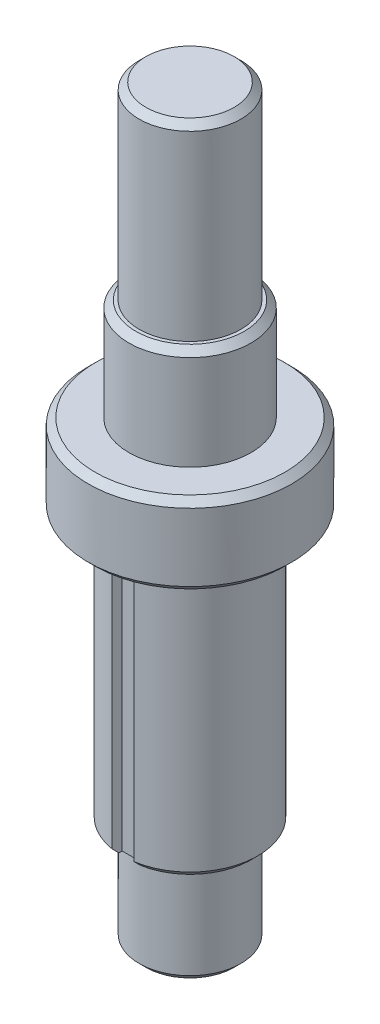
ISO-10303-21;
HEADER;
FILE_DESCRIPTION(('STEP AP214'),'2;1');
FILE_NAME('part.step','',(''),(''),'','','');
FILE_SCHEMA(('AUTOMOTIVE_DESIGN { 1 0 10303 214 1 1 1 1 }'));
ENDSEC;
DATA;
#1=APPLICATION_CONTEXT('core data for automotive mechanical design processes');
#2=APPLICATION_PROTOCOL_DEFINITION('international standard','automotive_design',2000,#1);
#3=PRODUCT_CONTEXT('',#1,'mechanical');
#4=PRODUCT('Part','Part','',(#3));
#5=PRODUCT_RELATED_PRODUCT_CATEGORY('part','',(#4));
#6=PRODUCT_DEFINITION_FORMATION('','',#4);
#7=PRODUCT_DEFINITION_CONTEXT('part definition',#1,'design');
#8=PRODUCT_DEFINITION('design','',#6,#7);
#9=PRODUCT_DEFINITION_SHAPE('','',#8);
#10=(LENGTH_UNIT() NAMED_UNIT(*) SI_UNIT(.MILLI.,.METRE.));
#11=(NAMED_UNIT(*) PLANE_ANGLE_UNIT() SI_UNIT($,.RADIAN.));
#12=(NAMED_UNIT(*) SI_UNIT($,.STERADIAN.) SOLID_ANGLE_UNIT());
#13=UNCERTAINTY_MEASURE_WITH_UNIT(LENGTH_MEASURE(1.E-05),#10,'distance_accuracy_value','');
#14=(GEOMETRIC_REPRESENTATION_CONTEXT(3) GLOBAL_UNCERTAINTY_ASSIGNED_CONTEXT((#13)) GLOBAL_UNIT_ASSIGNED_CONTEXT((#10,
#11,#12)) REPRESENTATION_CONTEXT('',''));
#15=CARTESIAN_POINT('',(0.,0.,0.));
#16=DIRECTION('',(0.,0.,1.));
#17=DIRECTION('',(1.,0.,0.));
#18=AXIS2_PLACEMENT_3D('',#15,#16,#17);
#19=CARTESIAN_POINT('',(0.,0.,0.));
#20=DIRECTION('',(0.,1.,0.));
#21=DIRECTION('',(-1.,0.,0.));
#22=AXIS2_PLACEMENT_3D('',#19,#20,#21);
#23=PLANE('',#22);
#24=CARTESIAN_POINT('',(0.,0.,0.));
#25=DIRECTION('',(0.,1.,0.));
#26=DIRECTION('',(-1.,0.,0.));
#27=AXIS2_PLACEMENT_3D('',#24,#25,#26);
#28=CIRCLE('',#27,6.50000000000002);
#29=CARTESIAN_POINT('',(-6.50000000000002,0.,0.));
#30=VERTEX_POINT('',#29);
#31=EDGE_CURVE('E211',#30,#30,#28,.F.);
#32=ORIENTED_EDGE('',*,*,#31,.T.);
#33=EDGE_LOOP('',(#32));
#34=FACE_BOUND('',#33,.T.);
#35=ADVANCED_FACE('F32',(#34),#23,.F.);
#36=CARTESIAN_POINT('',(0.,109.85,0.));
#37=DIRECTION('',(0.,1.,0.));
#38=DIRECTION('',(-1.,0.,0.));
#39=AXIS2_PLACEMENT_3D('',#36,#37,#38);
#40=CYLINDRICAL_SURFACE('',#39,7.5);
#41=CARTESIAN_POINT('',(0.,0.999999999999987,0.));
#42=DIRECTION('',(0.,1.,0.));
#43=DIRECTION('',(-1.,0.,0.));
#44=AXIS2_PLACEMENT_3D('',#41,#42,#43);
#45=CIRCLE('',#44,7.5);
#46=CARTESIAN_POINT('',(-7.5,0.999999999999987,0.));
#47=VERTEX_POINT('',#46);
#48=EDGE_CURVE('E208',#47,#47,#45,.T.);
#49=ORIENTED_EDGE('',*,*,#48,.T.);
#50=EDGE_LOOP('',(#49));
#51=FACE_BOUND('',#50,.T.);
#52=CARTESIAN_POINT('',(0.,15.,0.));
#53=DIRECTION('',(0.,1.,0.));
#54=DIRECTION('',(-1.,0.,0.));
#55=AXIS2_PLACEMENT_3D('',#52,#53,#54);
#56=CIRCLE('',#55,7.5);
#57=CARTESIAN_POINT('',(-7.5,15.,0.));
#58=VERTEX_POINT('',#57);
#59=EDGE_CURVE('E199',#58,#58,#56,.T.);
#60=ORIENTED_EDGE('',*,*,#59,.F.);
#61=EDGE_LOOP('',(#60));
#62=FACE_BOUND('',#61,.T.);
#63=ADVANCED_FACE('F283',(#51,#62),#40,.T.);
#64=CARTESIAN_POINT('',(7.5,15.,0.));
#65=DIRECTION('',(0.,1.,0.));
#66=DIRECTION('',(-1.,0.,0.));
#67=AXIS2_PLACEMENT_3D('',#64,#65,#66);
#68=PLANE('',#67);
#69=DIRECTION('',(0.,0.,-1.));
#70=VECTOR('',#69,1.);
#71=CARTESIAN_POINT('',(-1.625,15.,11.625));
#72=LINE('',#71,#70);
#73=CARTESIAN_POINT('',(-1.625,15.,8.85208308817759));
#74=VERTEX_POINT('',#73);
#75=CARTESIAN_POINT('',(-1.625,15.,8.375));
#76=VERTEX_POINT('',#75);
#77=EDGE_CURVE('E169',#74,#76,#72,.T.);
#78=ORIENTED_EDGE('',*,*,#77,.F.);
#79=CARTESIAN_POINT('',(0.,15.,0.));
#80=DIRECTION('',(0.,1.,0.));
#81=DIRECTION('',(-1.,0.,0.));
#82=AXIS2_PLACEMENT_3D('',#79,#80,#81);
#83=CIRCLE('',#82,8.99999999999998);
#84=CARTESIAN_POINT('',(1.625,15.,8.85208308817759));
#85=VERTEX_POINT('',#84);
#86=EDGE_CURVE('E61',#74,#85,#83,.F.);
#87=ORIENTED_EDGE('',*,*,#86,.T.);
#88=DIRECTION('',(0.,0.,1.));
#89=VECTOR('',#88,1.);
#90=CARTESIAN_POINT('',(1.625,15.,11.625));
#91=LINE('',#90,#89);
#92=CARTESIAN_POINT('',(1.625,15.,8.375));
#93=VERTEX_POINT('',#92);
#94=EDGE_CURVE('E164',#93,#85,#91,.T.);
#95=ORIENTED_EDGE('',*,*,#94,.F.);
#96=DIRECTION('',(1.,0.,0.));
#97=VECTOR('',#96,1.);
#98=CARTESIAN_POINT('',(-1.625,15.,8.375));
#99=LINE('',#98,#97);
#100=EDGE_CURVE('E165',#76,#93,#99,.T.);
#101=ORIENTED_EDGE('',*,*,#100,.F.);
#102=EDGE_LOOP('',(#78,#87,#95,#101));
#103=FACE_BOUND('',#102,.T.);
#104=ORIENTED_EDGE('',*,*,#59,.T.);
#105=EDGE_LOOP('',(#104));
#106=FACE_BOUND('',#105,.T.);
#107=ADVANCED_FACE('F279',(#103,#106),#68,.F.);
#108=CARTESIAN_POINT('',(0.,109.85,0.));
#109=DIRECTION('',(0.,1.,0.));
#110=DIRECTION('',(-1.,0.,0.));
#111=AXIS2_PLACEMENT_3D('',#108,#109,#110);
#112=CYLINDRICAL_SURFACE('',#111,10.);
#113=DIRECTION('',(0.,1.,0.));
#114=VECTOR('',#113,1.);
#115=CARTESIAN_POINT('',(1.625,109.85,9.86708543593294));
#116=LINE('',#115,#114);
#117=CARTESIAN_POINT('',(1.625,55.,9.86708543593294));
#118=VERTEX_POINT('',#117);
#119=CARTESIAN_POINT('',(1.625,16.,9.86708543593294));
#120=VERTEX_POINT('',#119);
#121=EDGE_CURVE('E175',#118,#120,#116,.F.);
#122=ORIENTED_EDGE('',*,*,#121,.T.);
#123=CARTESIAN_POINT('',(0.,16.,0.));
#124=DIRECTION('',(0.,1.,0.));
#125=DIRECTION('',(-1.,0.,0.));
#126=AXIS2_PLACEMENT_3D('',#123,#124,#125);
#127=CIRCLE('',#126,10.);
#128=CARTESIAN_POINT('',(-1.625,16.,9.86708543593294));
#129=VERTEX_POINT('',#128);
#130=EDGE_CURVE('E230',#120,#129,#127,.T.);
#131=ORIENTED_EDGE('',*,*,#130,.T.);
#132=DIRECTION('',(0.,1.,0.));
#133=VECTOR('',#132,1.);
#134=CARTESIAN_POINT('',(-1.625,109.85,9.86708543593294));
#135=LINE('',#134,#133);
#136=CARTESIAN_POINT('',(-1.625,55.,9.86708543593294));
#137=VERTEX_POINT('',#136);
#138=EDGE_CURVE('E187',#129,#137,#135,.T.);
#139=ORIENTED_EDGE('',*,*,#138,.T.);
#140=CARTESIAN_POINT('',(0.,55.,0.));
#141=DIRECTION('',(0.,1.,0.));
#142=DIRECTION('',(-1.,0.,0.));
#143=AXIS2_PLACEMENT_3D('',#140,#141,#142);
#144=CIRCLE('',#143,10.);
#145=EDGE_CURVE('E196',#118,#137,#144,.T.);
#146=ORIENTED_EDGE('',*,*,#145,.F.);
#147=EDGE_LOOP('',(#122,#131,#139,#146));
#148=FACE_BOUND('',#147,.T.);
#149=ADVANCED_FACE('F275',(#148),#112,.T.);
#150=CARTESIAN_POINT('',(10.,55.,0.));
#151=DIRECTION('',(0.,1.,0.));
#152=DIRECTION('',(-1.,0.,0.));
#153=AXIS2_PLACEMENT_3D('',#150,#151,#152);
#154=PLANE('',#153);
#155=CARTESIAN_POINT('',(0.,55.,0.));
#156=DIRECTION('',(0.,1.,0.));
#157=DIRECTION('',(-1.,0.,0.));
#158=AXIS2_PLACEMENT_3D('',#155,#156,#157);
#159=CIRCLE('',#158,14.);
#160=CARTESIAN_POINT('',(-14.,55.,0.));
#161=VERTEX_POINT('',#160);
#162=EDGE_CURVE('E223',#161,#161,#159,.F.);
#163=ORIENTED_EDGE('',*,*,#162,.T.);
#164=EDGE_LOOP('',(#163));
#165=FACE_BOUND('',#164,.T.);
#166=ORIENTED_EDGE('',*,*,#145,.T.);
#167=DIRECTION('',(0.,0.,-1.));
#168=VECTOR('',#167,1.);
#169=CARTESIAN_POINT('',(-1.625,55.,11.625));
#170=LINE('',#169,#168);
#171=CARTESIAN_POINT('',(-1.625,55.,8.375));
#172=VERTEX_POINT('',#171);
#173=EDGE_CURVE('E168',#137,#172,#170,.T.);
#174=ORIENTED_EDGE('',*,*,#173,.T.);
#175=DIRECTION('',(1.,0.,0.));
#176=VECTOR('',#175,1.);
#177=CARTESIAN_POINT('',(-1.625,55.,8.375));
#178=LINE('',#177,#176);
#179=CARTESIAN_POINT('',(1.625,55.,8.375));
#180=VERTEX_POINT('',#179);
#181=EDGE_CURVE('E177',#172,#180,#178,.T.);
#182=ORIENTED_EDGE('',*,*,#181,.T.);
#183=DIRECTION('',(0.,0.,1.));
#184=VECTOR('',#183,1.);
#185=CARTESIAN_POINT('',(1.625,55.,11.625));
#186=LINE('',#185,#184);
#187=EDGE_CURVE('E172',#180,#118,#186,.T.);
#188=ORIENTED_EDGE('',*,*,#187,.T.);
#189=EDGE_LOOP('',(#166,#174,#182,#188));
#190=FACE_BOUND('',#189,.T.);
#191=ADVANCED_FACE('F271',(#165,#190),#154,.F.);
#192=CARTESIAN_POINT('',(0.,109.85,0.));
#193=DIRECTION('',(0.,1.,0.));
#194=DIRECTION('',(-1.,0.,0.));
#195=AXIS2_PLACEMENT_3D('',#192,#193,#194);
#196=CYLINDRICAL_SURFACE('',#195,15.);
#197=CARTESIAN_POINT('',(0.,66.,0.));
#198=DIRECTION('',(0.,-1.,0.));
#199=DIRECTION('',(1.,0.,0.));
#200=AXIS2_PLACEMENT_3D('',#197,#198,#199);
#201=CIRCLE('',#200,15.);
#202=CARTESIAN_POINT('',(15.,66.,0.));
#203=VERTEX_POINT('',#202);
#204=EDGE_CURVE('E220',#203,#203,#201,.T.);
#205=ORIENTED_EDGE('',*,*,#204,.T.);
#206=EDGE_LOOP('',(#205));
#207=FACE_BOUND('',#206,.T.);
#208=CARTESIAN_POINT('',(0.,56.,0.));
#209=DIRECTION('',(0.,1.,0.));
#210=DIRECTION('',(-1.,0.,0.));
#211=AXIS2_PLACEMENT_3D('',#208,#209,#210);
#212=CIRCLE('',#211,15.);
#213=CARTESIAN_POINT('',(-15.,56.,0.));
#214=VERTEX_POINT('',#213);
#215=EDGE_CURVE('E217',#214,#214,#212,.T.);
#216=ORIENTED_EDGE('',*,*,#215,.T.);
#217=EDGE_LOOP('',(#216));
#218=FACE_BOUND('',#217,.T.);
#219=ADVANCED_FACE('F267',(#207,#218),#196,.T.);
#220=CARTESIAN_POINT('',(15.,67.,0.));
#221=DIRECTION('',(0.,-1.,0.));
#222=DIRECTION('',(1.,0.,0.));
#223=AXIS2_PLACEMENT_3D('',#220,#221,#222);
#224=PLANE('',#223);
#225=CARTESIAN_POINT('',(0.,67.,0.));
#226=DIRECTION('',(0.,-1.,0.));
#227=DIRECTION('',(1.,0.,0.));
#228=AXIS2_PLACEMENT_3D('',#225,#226,#227);
#229=CIRCLE('',#228,14.);
#230=CARTESIAN_POINT('',(14.,67.,0.));
#231=VERTEX_POINT('',#230);
#232=EDGE_CURVE('E214',#231,#231,#229,.F.);
#233=ORIENTED_EDGE('',*,*,#232,.T.);
#234=EDGE_LOOP('',(#233));
#235=FACE_BOUND('',#234,.T.);
#236=CARTESIAN_POINT('',(0.,67.,0.));
#237=DIRECTION('',(0.,1.,0.));
#238=DIRECTION('',(-1.,0.,0.));
#239=AXIS2_PLACEMENT_3D('',#236,#237,#238);
#240=CIRCLE('',#239,9.00000000000001);
#241=CARTESIAN_POINT('',(-1.625,67.,-8.85208308817761));
#242=VERTEX_POINT('',#241);
#243=CARTESIAN_POINT('',(1.625,67.,-8.85208308817761));
#244=VERTEX_POINT('',#243);
#245=EDGE_CURVE('E193',#242,#244,#240,.T.);
#246=ORIENTED_EDGE('',*,*,#245,.F.);
#247=DIRECTION('',(0.,0.,1.));
#248=VECTOR('',#247,1.);
#249=CARTESIAN_POINT('',(-1.625,67.,-10.625));
#250=LINE('',#249,#248);
#251=CARTESIAN_POINT('',(-1.625,67.,-7.375));
#252=VERTEX_POINT('',#251);
#253=EDGE_CURVE('E156',#242,#252,#250,.T.);
#254=ORIENTED_EDGE('',*,*,#253,.T.);
#255=DIRECTION('',(1.,0.,0.));
#256=VECTOR('',#255,1.);
#257=CARTESIAN_POINT('',(-1.625,67.,-7.375));
#258=LINE('',#257,#256);
#259=CARTESIAN_POINT('',(1.625,67.,-7.375));
#260=VERTEX_POINT('',#259);
#261=EDGE_CURVE('E141',#252,#260,#258,.T.);
#262=ORIENTED_EDGE('',*,*,#261,.T.);
#263=DIRECTION('',(0.,0.,-1.));
#264=VECTOR('',#263,1.);
#265=CARTESIAN_POINT('',(1.625,67.,-10.625));
#266=LINE('',#265,#264);
#267=EDGE_CURVE('E140',#260,#244,#266,.T.);
#268=ORIENTED_EDGE('',*,*,#267,.T.);
#269=EDGE_LOOP('',(#246,#254,#262,#268));
#270=FACE_BOUND('',#269,.T.);
#271=ADVANCED_FACE('F263',(#235,#270),#224,.F.);
#272=CARTESIAN_POINT('',(0.,109.85,0.));
#273=DIRECTION('',(0.,1.,0.));
#274=DIRECTION('',(-1.,0.,0.));
#275=AXIS2_PLACEMENT_3D('',#272,#273,#274);
#276=CYLINDRICAL_SURFACE('',#275,9.00000000000001);
#277=CARTESIAN_POINT('',(0.,81.,0.));
#278=DIRECTION('',(0.,-1.,0.));
#279=DIRECTION('',(1.,0.,0.));
#280=AXIS2_PLACEMENT_3D('',#277,#278,#279);
#281=CIRCLE('',#280,9.00000000000001);
#282=CARTESIAN_POINT('',(1.625,81.,-8.85208308817761));
#283=VERTEX_POINT('',#282);
#284=CARTESIAN_POINT('',(-1.625,81.,-8.85208308817761));
#285=VERTEX_POINT('',#284);
#286=EDGE_CURVE('E227',#283,#285,#281,.T.);
#287=ORIENTED_EDGE('',*,*,#286,.T.);
#288=DIRECTION('',(0.,1.,0.));
#289=VECTOR('',#288,1.);
#290=CARTESIAN_POINT('',(-1.625,109.85,-8.85208308817761));
#291=LINE('',#290,#289);
#292=EDGE_CURVE('E161',#285,#242,#291,.F.);
#293=ORIENTED_EDGE('',*,*,#292,.T.);
#294=ORIENTED_EDGE('',*,*,#245,.T.);
#295=DIRECTION('',(0.,1.,0.));
#296=VECTOR('',#295,1.);
#297=CARTESIAN_POINT('',(1.625,109.85,-8.85208308817761));
#298=LINE('',#297,#296);
#299=EDGE_CURVE('E153',#244,#283,#298,.T.);
#300=ORIENTED_EDGE('',*,*,#299,.T.);
#301=EDGE_LOOP('',(#287,#293,#294,#300));
#302=FACE_BOUND('',#301,.T.);
#303=ADVANCED_FACE('F260',(#302),#276,.T.);
#304=CARTESIAN_POINT('',(9.00000000000001,82.,0.));
#305=DIRECTION('',(0.,-1.,0.));
#306=DIRECTION('',(1.,0.,0.));
#307=AXIS2_PLACEMENT_3D('',#304,#305,#306);
#308=PLANE('',#307);
#309=DIRECTION('',(1.,0.,0.));
#310=VECTOR('',#309,1.);
#311=CARTESIAN_POINT('',(-1.625,82.,-7.375));
#312=LINE('',#311,#310);
#313=CARTESIAN_POINT('',(-1.625,82.,-7.375));
#314=VERTEX_POINT('',#313);
#315=CARTESIAN_POINT('',(-1.36358901432944,82.,-7.375));
#316=VERTEX_POINT('',#315);
#317=EDGE_CURVE('E137',#314,#316,#312,.T.);
#318=ORIENTED_EDGE('',*,*,#317,.F.);
#319=DIRECTION('',(0.,0.,1.));
#320=VECTOR('',#319,1.);
#321=CARTESIAN_POINT('',(-1.625,82.,-10.625));
#322=LINE('',#321,#320);
#323=CARTESIAN_POINT('',(-1.625,82.,-7.83322251694666));
#324=VERTEX_POINT('',#323);
#325=EDGE_CURVE('E135',#324,#314,#322,.T.);
#326=ORIENTED_EDGE('',*,*,#325,.F.);
#327=CARTESIAN_POINT('',(0.,82.,0.));
#328=DIRECTION('',(0.,-1.,0.));
#329=DIRECTION('',(1.,0.,0.));
#330=AXIS2_PLACEMENT_3D('',#327,#328,#329);
#331=CIRCLE('',#330,8.00000000000001);
#332=CARTESIAN_POINT('',(1.625,82.,-7.83322251694666));
#333=VERTEX_POINT('',#332);
#334=EDGE_CURVE('E148',#324,#333,#331,.F.);
#335=ORIENTED_EDGE('',*,*,#334,.T.);
#336=DIRECTION('',(0.,0.,-1.));
#337=VECTOR('',#336,1.);
#338=CARTESIAN_POINT('',(1.625,82.,-10.625));
#339=LINE('',#338,#337);
#340=CARTESIAN_POINT('',(1.625,82.,-7.375));
#341=VERTEX_POINT('',#340);
#342=EDGE_CURVE('E53',#341,#333,#339,.T.);
#343=ORIENTED_EDGE('',*,*,#342,.F.);
#344=CARTESIAN_POINT('',(1.36358901432944,82.,-7.375));
#345=VERTEX_POINT('',#344);
#346=EDGE_CURVE('E124',#345,#341,#312,.T.);
#347=ORIENTED_EDGE('',*,*,#346,.F.);
#348=CARTESIAN_POINT('',(0.,82.,0.));
#349=DIRECTION('',(0.,1.,0.));
#350=DIRECTION('',(-1.,0.,0.));
#351=AXIS2_PLACEMENT_3D('',#348,#349,#350);
#352=CIRCLE('',#351,7.5);
#353=EDGE_CURVE('E189',#316,#345,#352,.T.);
#354=ORIENTED_EDGE('',*,*,#353,.F.);
#355=EDGE_LOOP('',(#318,#326,#335,#343,#347,#354));
#356=FACE_BOUND('',#355,.T.);
#357=ADVANCED_FACE('F145',(#356),#308,.F.);
#358=CARTESIAN_POINT('',(0.,109.85,0.));
#359=DIRECTION('',(0.,1.,0.));
#360=DIRECTION('',(-1.,0.,0.));
#361=AXIS2_PLACEMENT_3D('',#358,#359,#360);
#362=CYLINDRICAL_SURFACE('',#361,7.5);
#363=CARTESIAN_POINT('',(0.,108.85,0.));
#364=DIRECTION('',(0.,-1.,0.));
#365=DIRECTION('',(1.,0.,0.));
#366=AXIS2_PLACEMENT_3D('',#363,#364,#365);
#367=CIRCLE('',#366,7.5);
#368=CARTESIAN_POINT('',(7.5,108.85,0.));
#369=VERTEX_POINT('',#368);
#370=EDGE_CURVE('E205',#369,#369,#367,.T.);
#371=ORIENTED_EDGE('',*,*,#370,.T.);
#372=EDGE_LOOP('',(#371));
#373=FACE_BOUND('',#372,.T.);
#374=EDGE_CURVE('E190',#345,#316,#352,.T.);
#375=ORIENTED_EDGE('',*,*,#374,.T.);
#376=ORIENTED_EDGE('',*,*,#353,.T.);
#377=EDGE_LOOP('',(#375,#376));
#378=FACE_BOUND('',#377,.T.);
#379=ADVANCED_FACE('F253',(#373,#378),#362,.T.);
#380=CARTESIAN_POINT('',(7.5,109.85,0.));
#381=DIRECTION('',(0.,-1.,0.));
#382=DIRECTION('',(1.,0.,0.));
#383=AXIS2_PLACEMENT_3D('',#380,#381,#382);
#384=PLANE('',#383);
#385=CARTESIAN_POINT('',(0.,109.85,0.));
#386=DIRECTION('',(0.,-1.,0.));
#387=DIRECTION('',(1.,0.,0.));
#388=AXIS2_PLACEMENT_3D('',#385,#386,#387);
#389=CIRCLE('',#388,6.49999999999999);
#390=CARTESIAN_POINT('',(6.49999999999999,109.85,0.));
#391=VERTEX_POINT('',#390);
#392=EDGE_CURVE('E202',#391,#391,#389,.F.);
#393=ORIENTED_EDGE('',*,*,#392,.T.);
#394=EDGE_LOOP('',(#393));
#395=FACE_BOUND('',#394,.T.);
#396=ADVANCED_FACE('F247',(#395),#384,.F.);
#397=CARTESIAN_POINT('',(-1.625,59.5961940777126,11.625));
#398=DIRECTION('',(-1.,0.,0.));
#399=DIRECTION('',(0.,0.,1.));
#400=AXIS2_PLACEMENT_3D('',#397,#398,#399);
#401=PLANE('',#400);
#402=ORIENTED_EDGE('',*,*,#138,.F.);
#403=CARTESIAN_POINT('',(-1.625,16.,9.86708543593294));
#404=CARTESIAN_POINT('',(-1.625,15.8331987737948,9.69805095141648));
#405=CARTESIAN_POINT('',(-1.625,15.6664648280521,9.52895018088338));
#406=CARTESIAN_POINT('',(-1.625,15.3331314947165,9.19061606496714));
#407=CARTESIAN_POINT('',(-1.625,15.1665321071259,9.02138271958178));
#408=CARTESIAN_POINT('',(-1.625,15.,8.85208308817759));
#409=B_SPLINE_CURVE_WITH_KNOTS('',3,(#403,#404,#405,#406,#407,#408),.UNSPECIFIED.,.F.,.F.,(4,2,
4),(0.,0.712430707732584,1.42486142732787),.UNSPECIFIED.);
#410=EDGE_CURVE('E233',#129,#74,#409,.T.);
#411=ORIENTED_EDGE('',*,*,#410,.T.);
#412=ORIENTED_EDGE('',*,*,#77,.T.);
#413=DIRECTION('',(0.,-1.,0.));
#414=VECTOR('',#413,1.);
#415=CARTESIAN_POINT('',(-1.625,59.5961940777126,8.375));
#416=LINE('',#415,#414);
#417=EDGE_CURVE('E180',#172,#76,#416,.T.);
#418=ORIENTED_EDGE('',*,*,#417,.F.);
#419=ORIENTED_EDGE('',*,*,#173,.F.);
#420=EDGE_LOOP('',(#402,#411,#412,#418,#419));
#421=FACE_BOUND('',#420,.T.);
#422=ADVANCED_FACE('F241',(#421),#401,.F.);
#423=CARTESIAN_POINT('',(1.625,59.5961940777126,11.625));
#424=DIRECTION('',(1.,0.,0.));
#425=DIRECTION('',(0.,0.,-1.));
#426=AXIS2_PLACEMENT_3D('',#423,#424,#425);
#427=PLANE('',#426);
#428=ORIENTED_EDGE('',*,*,#94,.T.);
#429=CARTESIAN_POINT('',(1.625,15.,8.85208308817759));
#430=CARTESIAN_POINT('',(1.625,15.1665321071259,9.02138271958178));
#431=CARTESIAN_POINT('',(1.625,15.3331314947165,9.19061606496714));
#432=CARTESIAN_POINT('',(1.625,15.6664648280521,9.52895018088339));
#433=CARTESIAN_POINT('',(1.625,15.8331987737948,9.69805095141648));
#434=CARTESIAN_POINT('',(1.625,16.,9.86708543593294));
#435=B_SPLINE_CURVE_WITH_KNOTS('',3,(#429,#430,#431,#432,#433,#434),.UNSPECIFIED.,.F.,.F.,(4,2,
4),(0.,0.712430719595283,1.42486142732787),.UNSPECIFIED.);
#436=EDGE_CURVE('E315',#85,#120,#435,.T.);
#437=ORIENTED_EDGE('',*,*,#436,.T.);
#438=ORIENTED_EDGE('',*,*,#121,.F.);
#439=ORIENTED_EDGE('',*,*,#187,.F.);
#440=DIRECTION('',(0.,-1.,0.));
#441=VECTOR('',#440,1.);
#442=CARTESIAN_POINT('',(1.625,59.5961940777126,8.375));
#443=LINE('',#442,#441);
#444=EDGE_CURVE('E176',#180,#93,#443,.T.);
#445=ORIENTED_EDGE('',*,*,#444,.T.);
#446=EDGE_LOOP('',(#428,#437,#438,#439,#445));
#447=FACE_BOUND('',#446,.T.);
#448=ADVANCED_FACE('F246',(#447),#427,.F.);
#449=CARTESIAN_POINT('',(-1.625,59.5961940777126,8.375));
#450=DIRECTION('',(0.,0.,-1.));
#451=DIRECTION('',(-1.,0.,0.));
#452=AXIS2_PLACEMENT_3D('',#449,#450,#451);
#453=PLANE('',#452);
#454=ORIENTED_EDGE('',*,*,#417,.T.);
#455=ORIENTED_EDGE('',*,*,#100,.T.);
#456=ORIENTED_EDGE('',*,*,#444,.F.);
#457=ORIENTED_EDGE('',*,*,#181,.F.);
#458=EDGE_LOOP('',(#454,#455,#456,#457));
#459=FACE_BOUND('',#458,.T.);
#460=ADVANCED_FACE('F249',(#459),#453,.F.);
#461=CARTESIAN_POINT('',(0.,109.85,0.));
#462=DIRECTION('',(0.,-1.,0.));
#463=DIRECTION('',(1.,0.,0.));
#464=AXIS2_PLACEMENT_3D('',#461,#462,#463);
#465=CONICAL_SURFACE('',#464,6.49999999999999,0.785398163397451);
#466=ORIENTED_EDGE('',*,*,#370,.F.);
#467=EDGE_LOOP('',(#466));
#468=FACE_BOUND('',#467,.T.);
#469=ORIENTED_EDGE('',*,*,#392,.F.);
#470=EDGE_LOOP('',(#469));
#471=FACE_BOUND('',#470,.T.);
#472=ADVANCED_FACE('F290',(#468,#471),#465,.T.);
#473=CARTESIAN_POINT('',(0.,0.999999999999987,0.));
#474=DIRECTION('',(0.,1.,0.));
#475=DIRECTION('',(-1.,0.,0.));
#476=AXIS2_PLACEMENT_3D('',#473,#474,#475);
#477=CONICAL_SURFACE('',#476,7.5,0.785398163397445);
#478=ORIENTED_EDGE('',*,*,#31,.F.);
#479=EDGE_LOOP('',(#478));
#480=FACE_BOUND('',#479,.T.);
#481=ORIENTED_EDGE('',*,*,#48,.F.);
#482=EDGE_LOOP('',(#481));
#483=FACE_BOUND('',#482,.T.);
#484=ADVANCED_FACE('F293',(#480,#483),#477,.T.);
#485=CARTESIAN_POINT('',(0.,67.,0.));
#486=DIRECTION('',(0.,-1.,0.));
#487=DIRECTION('',(1.,0.,0.));
#488=AXIS2_PLACEMENT_3D('',#485,#486,#487);
#489=CONICAL_SURFACE('',#488,14.,0.785398163397443);
#490=ORIENTED_EDGE('',*,*,#204,.F.);
#491=EDGE_LOOP('',(#490));
#492=FACE_BOUND('',#491,.T.);
#493=ORIENTED_EDGE('',*,*,#232,.F.);
#494=EDGE_LOOP('',(#493));
#495=FACE_BOUND('',#494,.T.);
#496=ADVANCED_FACE('F297',(#492,#495),#489,.T.);
#497=CARTESIAN_POINT('',(0.,56.,0.));
#498=DIRECTION('',(0.,1.,0.));
#499=DIRECTION('',(-1.,0.,0.));
#500=AXIS2_PLACEMENT_3D('',#497,#498,#499);
#501=CONICAL_SURFACE('',#500,15.,0.785398163397455);
#502=ORIENTED_EDGE('',*,*,#162,.F.);
#503=EDGE_LOOP('',(#502));
#504=FACE_BOUND('',#503,.T.);
#505=ORIENTED_EDGE('',*,*,#215,.F.);
#506=EDGE_LOOP('',(#505));
#507=FACE_BOUND('',#506,.T.);
#508=ADVANCED_FACE('F301',(#504,#507),#501,.T.);
#509=CARTESIAN_POINT('',(0.,82.,0.));
#510=DIRECTION('',(0.,-1.,0.));
#511=DIRECTION('',(1.,0.,0.));
#512=AXIS2_PLACEMENT_3D('',#509,#510,#511);
#513=CONICAL_SURFACE('',#512,8.00000000000001,0.785398163397447);
#514=CARTESIAN_POINT('',(-1.625,78.5367620013898,-11.3474755083578));
#515=CARTESIAN_POINT('',(-1.625,78.973028490968,-10.9067008366485));
#516=CARTESIAN_POINT('',(-1.625,79.4090909339114,-10.4657227931871));
#517=CARTESIAN_POINT('',(-1.625,80.2804530012764,-9.58302094821458));
#518=CARTESIAN_POINT('',(-1.625,80.7157526318521,-9.1412971527768));
#519=CARTESIAN_POINT('',(-1.625,81.3678708142734,-8.47789092046407));
#520=CARTESIAN_POINT('',(-1.625,81.5851057867356,-8.25661794657441));
#521=CARTESIAN_POINT('',(-1.625,82.0192161780506,-7.81371989164267));
#522=CARTESIAN_POINT('',(-1.625,82.2360915972019,-7.59209481089326));
#523=CARTESIAN_POINT('',(-1.625,82.6693870900651,-7.1483961463637));
#524=CARTESIAN_POINT('',(-1.625,82.885807160049,-6.92632255894065));
#525=CARTESIAN_POINT('',(-1.625,83.3180283034707,-6.48157272397844));
#526=CARTESIAN_POINT('',(-1.625,83.5338293751224,-6.25889647470398));
#527=CARTESIAN_POINT('',(-1.625,83.7492393846563,-6.0358415544423));
#528=B_SPLINE_CURVE_WITH_KNOTS('',3,(#514,#515,#516,#517,#518,#519,#520,#521,#522,#523,#524,
#525,#526,#527),.UNSPECIFIED.,.F.,.F.,(4,2,2,2,2,2,4),(0.,1.8605113973532,3.72100771495598,
4.65126264323239,5.58151679868638,6.51177854055999,7.44204296388435),.UNSPECIFIED.);
#529=EDGE_CURVE('E11',#285,#324,#528,.T.);
#530=ORIENTED_EDGE('',*,*,#529,.F.);
#531=ORIENTED_EDGE('',*,*,#286,.F.);
#532=CARTESIAN_POINT('',(1.625,83.7492393846563,-6.0358415544423));
#533=CARTESIAN_POINT('',(1.625,83.5338293751224,-6.25889647470398));
#534=CARTESIAN_POINT('',(1.625,83.3180283034707,-6.48157272397844));
#535=CARTESIAN_POINT('',(1.625,82.885807160049,-6.92632255894065));
#536=CARTESIAN_POINT('',(1.625,82.6693870900651,-7.1483961463637));
#537=CARTESIAN_POINT('',(1.625,82.2360915972019,-7.59209481089326));
#538=CARTESIAN_POINT('',(1.625,82.0192161780506,-7.81371989164266));
#539=CARTESIAN_POINT('',(1.625,81.5851057867356,-8.25661794657441));
#540=CARTESIAN_POINT('',(1.625,81.3678708142734,-8.47789092046407));
#541=CARTESIAN_POINT('',(1.625,80.7157526318521,-9.1412971527768));
#542=CARTESIAN_POINT('',(1.625,80.2804530012764,-9.58302094821459));
#543=CARTESIAN_POINT('',(1.625,79.4090909339114,-10.4657227931871));
#544=CARTESIAN_POINT('',(1.625,78.973028490968,-10.9067008366484));
#545=CARTESIAN_POINT('',(1.625,78.5367620013898,-11.3474755083578));
#546=B_SPLINE_CURVE_WITH_KNOTS('',3,(#532,#533,#534,#535,#536,#537,#538,#539,#540,#541,#542,
#543,#544,#545),.UNSPECIFIED.,.F.,.F.,(4,2,2,2,2,2,4),(0.,0.930264423324359,1.86052616519797,
2.79078032065196,3.72103524892837,5.58153156653115,7.44204296388435),.UNSPECIFIED.);
#547=EDGE_CURVE('E46',#333,#283,#546,.T.);
#548=ORIENTED_EDGE('',*,*,#547,.F.);
#549=ORIENTED_EDGE('',*,*,#334,.F.);
#550=EDGE_LOOP('',(#530,#531,#548,#549));
#551=FACE_BOUND('',#550,.T.);
#552=ADVANCED_FACE('F304',(#551),#513,.T.);
#553=CARTESIAN_POINT('',(0.,16.,0.));
#554=DIRECTION('',(0.,1.,0.));
#555=DIRECTION('',(-1.,0.,0.));
#556=AXIS2_PLACEMENT_3D('',#553,#554,#555);
#557=CONICAL_SURFACE('',#556,10.,0.78539816339745);
#558=ORIENTED_EDGE('',*,*,#436,.F.);
#559=ORIENTED_EDGE('',*,*,#86,.F.);
#560=ORIENTED_EDGE('',*,*,#410,.F.);
#561=ORIENTED_EDGE('',*,*,#130,.F.);
#562=EDGE_LOOP('',(#558,#559,#560,#561));
#563=FACE_BOUND('',#562,.T.);
#564=ADVANCED_FACE('F34',(#563),#557,.T.);
#565=CARTESIAN_POINT('',(0.,82.,0.));
#566=DIRECTION('',(0.,1.,0.));
#567=DIRECTION('',(0.,0.,1.));
#568=AXIS2_PLACEMENT_3D('',#565,#566,#567);
#569=PLANE('',#568);
#570=EDGE_CURVE('E131',#316,#345,#312,.T.);
#571=ORIENTED_EDGE('',*,*,#570,.F.);
#572=ORIENTED_EDGE('',*,*,#374,.F.);
#573=EDGE_LOOP('',(#571,#572));
#574=FACE_BOUND('',#573,.T.);
#575=ADVANCED_FACE('F325',(#574),#569,.F.);
#576=CARTESIAN_POINT('',(-1.625,62.4038059222874,-10.625));
#577=DIRECTION('',(-1.,0.,0.));
#578=DIRECTION('',(0.,0.,1.));
#579=AXIS2_PLACEMENT_3D('',#576,#577,#578);
#580=PLANE('',#579);
#581=ORIENTED_EDGE('',*,*,#529,.T.);
#582=ORIENTED_EDGE('',*,*,#325,.T.);
#583=DIRECTION('',(0.,1.,0.));
#584=VECTOR('',#583,1.);
#585=CARTESIAN_POINT('',(-1.625,62.4038059222874,-7.375));
#586=LINE('',#585,#584);
#587=EDGE_CURVE('E155',#252,#314,#586,.T.);
#588=ORIENTED_EDGE('',*,*,#587,.F.);
#589=ORIENTED_EDGE('',*,*,#253,.F.);
#590=ORIENTED_EDGE('',*,*,#292,.F.);
#591=EDGE_LOOP('',(#581,#582,#588,#589,#590));
#592=FACE_BOUND('',#591,.T.);
#593=ADVANCED_FACE('F324',(#592),#580,.F.);
#594=CARTESIAN_POINT('',(1.625,62.4038059222874,-10.625));
#595=DIRECTION('',(1.,0.,0.));
#596=DIRECTION('',(0.,0.,-1.));
#597=AXIS2_PLACEMENT_3D('',#594,#595,#596);
#598=PLANE('',#597);
#599=ORIENTED_EDGE('',*,*,#267,.F.);
#600=DIRECTION('',(0.,1.,0.));
#601=VECTOR('',#600,1.);
#602=CARTESIAN_POINT('',(1.625,62.4038059222874,-7.375));
#603=LINE('',#602,#601);
#604=EDGE_CURVE('E128',#260,#341,#603,.T.);
#605=ORIENTED_EDGE('',*,*,#604,.T.);
#606=ORIENTED_EDGE('',*,*,#342,.T.);
#607=ORIENTED_EDGE('',*,*,#547,.T.);
#608=ORIENTED_EDGE('',*,*,#299,.F.);
#609=EDGE_LOOP('',(#599,#605,#606,#607,#608));
#610=FACE_BOUND('',#609,.T.);
#611=ADVANCED_FACE('F138',(#610),#598,.F.);
#612=CARTESIAN_POINT('',(-1.625,62.4038059222874,-7.375));
#613=DIRECTION('',(0.,0.,1.));
#614=DIRECTION('',(1.,0.,0.));
#615=AXIS2_PLACEMENT_3D('',#612,#613,#614);
#616=PLANE('',#615);
#617=ORIENTED_EDGE('',*,*,#587,.T.);
#618=ORIENTED_EDGE('',*,*,#317,.T.);
#619=ORIENTED_EDGE('',*,*,#570,.T.);
#620=ORIENTED_EDGE('',*,*,#346,.T.);
#621=ORIENTED_EDGE('',*,*,#604,.F.);
#622=ORIENTED_EDGE('',*,*,#261,.F.);
#623=EDGE_LOOP('',(#617,#618,#619,#620,#621,#622));
#624=FACE_BOUND('',#623,.T.);
#625=ADVANCED_FACE('F126',(#624),#616,.F.);
#626=CLOSED_SHELL('',(#35,#63,#107,#149,#191,#219,#271,#303,#357,#379,#396,#422,#448,#460,#472,
#484,#496,#508,#552,#564,#575,#593,#611,#625));
#627=MANIFOLD_SOLID_BREP('B2',#626);
#628=ADVANCED_BREP_SHAPE_REPRESENTATION('',(#18,#627),#14);
#629=SHAPE_DEFINITION_REPRESENTATION(#9,#628);
ENDSEC;
END-ISO-10303-21;
